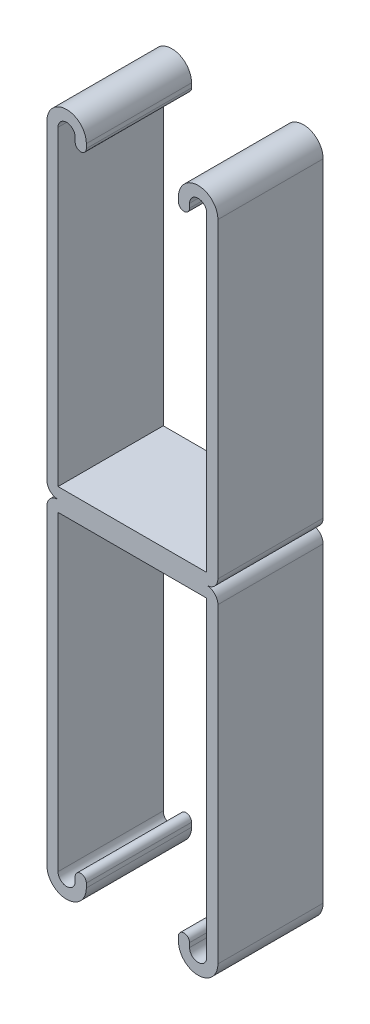
ISO-10303-21;
HEADER;
FILE_DESCRIPTION(('STEP AP214'),'2;1');
FILE_NAME('part.step','',(''),(''),'','','');
FILE_SCHEMA(('AUTOMOTIVE_DESIGN { 1 0 10303 214 1 1 1 1 }'));
ENDSEC;
DATA;
#1=APPLICATION_CONTEXT('core data for automotive mechanical design processes');
#2=APPLICATION_PROTOCOL_DEFINITION('international standard','automotive_design',2000,#1);
#3=PRODUCT_CONTEXT('',#1,'mechanical');
#4=PRODUCT('Part','Part','',(#3));
#5=PRODUCT_RELATED_PRODUCT_CATEGORY('part','',(#4));
#6=PRODUCT_DEFINITION_FORMATION('','',#4);
#7=PRODUCT_DEFINITION_CONTEXT('part definition',#1,'design');
#8=PRODUCT_DEFINITION('design','',#6,#7);
#9=PRODUCT_DEFINITION_SHAPE('','',#8);
#10=(LENGTH_UNIT() NAMED_UNIT(*) SI_UNIT(.MILLI.,.METRE.));
#11=(NAMED_UNIT(*) PLANE_ANGLE_UNIT() SI_UNIT($,.RADIAN.));
#12=(NAMED_UNIT(*) SI_UNIT($,.STERADIAN.) SOLID_ANGLE_UNIT());
#13=UNCERTAINTY_MEASURE_WITH_UNIT(LENGTH_MEASURE(1.E-05),#10,'distance_accuracy_value','');
#14=(GEOMETRIC_REPRESENTATION_CONTEXT(3) GLOBAL_UNCERTAINTY_ASSIGNED_CONTEXT((#13)) GLOBAL_UNIT_ASSIGNED_CONTEXT((#10,
#11,#12)) REPRESENTATION_CONTEXT('',''));
#15=CARTESIAN_POINT('',(0.,0.,0.));
#16=DIRECTION('',(0.,0.,1.));
#17=DIRECTION('',(1.,0.,0.));
#18=AXIS2_PLACEMENT_3D('',#15,#16,#17);
#19=CARTESIAN_POINT('',(-15.875,77.7875,12.7));
#20=DIRECTION('',(0.,0.,-1.));
#21=DIRECTION('',(-1.,0.,0.));
#22=AXIS2_PLACEMENT_3D('',#19,#20,#21);
#23=CYLINDRICAL_SURFACE('',#22,4.76250000000001);
#24=CARTESIAN_POINT('',(-15.875,77.7875,-12.7));
#25=DIRECTION('',(0.,0.,1.));
#26=DIRECTION('',(-1.,0.,0.));
#27=AXIS2_PLACEMENT_3D('',#24,#25,#26);
#28=CIRCLE('',#27,4.76250000000001);
#29=CARTESIAN_POINT('',(-11.1125,77.7875,-12.7));
#30=VERTEX_POINT('',#29);
#31=CARTESIAN_POINT('',(-20.6375,77.7875,-12.7));
#32=VERTEX_POINT('',#31);
#33=EDGE_CURVE('E189',#30,#32,#28,.T.);
#34=ORIENTED_EDGE('',*,*,#33,.T.);
#35=DIRECTION('',(0.,0.,-1.));
#36=VECTOR('',#35,1.);
#37=CARTESIAN_POINT('',(-20.6375,77.7875,12.7));
#38=LINE('',#37,#36);
#39=CARTESIAN_POINT('',(-20.6375,77.7875,12.7));
#40=VERTEX_POINT('',#39);
#41=EDGE_CURVE('E11',#40,#32,#38,.T.);
#42=ORIENTED_EDGE('',*,*,#41,.F.);
#43=CARTESIAN_POINT('',(-15.875,77.7875,12.7));
#44=DIRECTION('',(0.,0.,1.));
#45=DIRECTION('',(-1.,0.,0.));
#46=AXIS2_PLACEMENT_3D('',#43,#44,#45);
#47=CIRCLE('',#46,4.76250000000001);
#48=CARTESIAN_POINT('',(-11.1125,77.7875,12.7));
#49=VERTEX_POINT('',#48);
#50=EDGE_CURVE('E222',#49,#40,#47,.T.);
#51=ORIENTED_EDGE('',*,*,#50,.F.);
#52=DIRECTION('',(0.,0.,-1.));
#53=VECTOR('',#52,1.);
#54=CARTESIAN_POINT('',(-11.1125,77.7875,12.7));
#55=LINE('',#54,#53);
#56=EDGE_CURVE('E185',#49,#30,#55,.T.);
#57=ORIENTED_EDGE('',*,*,#56,.T.);
#58=EDGE_LOOP('',(#34,#42,#51,#57));
#59=FACE_BOUND('',#58,.T.);
#60=ADVANCED_FACE('F32',(#59),#23,.T.);
#61=CARTESIAN_POINT('',(-20.6375,77.7875,12.7));
#62=DIRECTION('',(1.,0.,0.));
#63=DIRECTION('',(0.,1.,0.));
#64=AXIS2_PLACEMENT_3D('',#61,#62,#63);
#65=PLANE('',#64);
#66=DIRECTION('',(0.,-1.,0.));
#67=VECTOR('',#66,1.);
#68=CARTESIAN_POINT('',(-20.6375,77.7875,-12.7));
#69=LINE('',#68,#67);
#70=CARTESIAN_POINT('',(-20.6375,2.6924,-12.7));
#71=VERTEX_POINT('',#70);
#72=EDGE_CURVE('E192',#32,#71,#69,.T.);
#73=ORIENTED_EDGE('',*,*,#72,.T.);
#74=DIRECTION('',(0.,0.,-1.));
#75=VECTOR('',#74,1.);
#76=CARTESIAN_POINT('',(-20.6375,2.6924,12.7));
#77=LINE('',#76,#75);
#78=CARTESIAN_POINT('',(-20.6375,2.6924,12.7));
#79=VERTEX_POINT('',#78);
#80=EDGE_CURVE('E40',#79,#71,#77,.T.);
#81=ORIENTED_EDGE('',*,*,#80,.F.);
#82=DIRECTION('',(0.,-1.,0.));
#83=VECTOR('',#82,1.);
#84=CARTESIAN_POINT('',(-20.6375,77.7875,12.7));
#85=LINE('',#84,#83);
#86=EDGE_CURVE('E119',#40,#79,#85,.T.);
#87=ORIENTED_EDGE('',*,*,#86,.F.);
#88=ORIENTED_EDGE('',*,*,#41,.T.);
#89=EDGE_LOOP('',(#73,#81,#87,#88));
#90=FACE_BOUND('',#89,.T.);
#91=ADVANCED_FACE('F384',(#90),#65,.F.);
#92=CARTESIAN_POINT('',(-17.9451,2.6924,12.7));
#93=DIRECTION('',(0.,0.,-1.));
#94=DIRECTION('',(-1.,0.,0.));
#95=AXIS2_PLACEMENT_3D('',#92,#93,#94);
#96=CYLINDRICAL_SURFACE('',#95,2.6924);
#97=CARTESIAN_POINT('',(-17.9451,2.6924,-12.7));
#98=DIRECTION('',(0.,0.,1.));
#99=DIRECTION('',(-1.,0.,0.));
#100=AXIS2_PLACEMENT_3D('',#97,#98,#99);
#101=CIRCLE('',#100,2.6924);
#102=CARTESIAN_POINT('',(-17.9451,0.,-12.7));
#103=VERTEX_POINT('',#102);
#104=EDGE_CURVE('E195',#71,#103,#101,.T.);
#105=ORIENTED_EDGE('',*,*,#104,.T.);
#106=DIRECTION('',(0.,0.,-1.));
#107=VECTOR('',#106,1.);
#108=CARTESIAN_POINT('',(-17.9451,0.,12.7));
#109=LINE('',#108,#107);
#110=CARTESIAN_POINT('',(-17.9451,0.,12.7));
#111=VERTEX_POINT('',#110);
#112=EDGE_CURVE('E259',#111,#103,#109,.T.);
#113=ORIENTED_EDGE('',*,*,#112,.F.);
#114=CARTESIAN_POINT('',(-17.9451,2.6924,12.7));
#115=DIRECTION('',(0.,0.,1.));
#116=DIRECTION('',(-1.,0.,0.));
#117=AXIS2_PLACEMENT_3D('',#114,#115,#116);
#118=CIRCLE('',#117,2.6924);
#119=EDGE_CURVE('E267',#79,#111,#118,.T.);
#120=ORIENTED_EDGE('',*,*,#119,.F.);
#121=ORIENTED_EDGE('',*,*,#80,.T.);
#122=EDGE_LOOP('',(#105,#113,#120,#121));
#123=FACE_BOUND('',#122,.T.);
#124=ADVANCED_FACE('F265',(#123),#96,.T.);
#125=CARTESIAN_POINT('',(17.9451,2.69240000000001,12.7));
#126=DIRECTION('',(0.,0.,-1.));
#127=DIRECTION('',(-1.,0.,0.));
#128=AXIS2_PLACEMENT_3D('',#125,#126,#127);
#129=CYLINDRICAL_SURFACE('',#128,2.6924);
#130=CARTESIAN_POINT('',(17.9451,2.69240000000001,-12.7));
#131=DIRECTION('',(0.,0.,1.));
#132=DIRECTION('',(1.,0.,0.));
#133=AXIS2_PLACEMENT_3D('',#130,#131,#132);
#134=CIRCLE('',#133,2.6924);
#135=CARTESIAN_POINT('',(17.9451,0.,-12.7));
#136=VERTEX_POINT('',#135);
#137=CARTESIAN_POINT('',(20.6375,2.69240000000001,-12.7));
#138=VERTEX_POINT('',#137);
#139=EDGE_CURVE('E197',#136,#138,#134,.T.);
#140=ORIENTED_EDGE('',*,*,#139,.T.);
#141=DIRECTION('',(0.,0.,-1.));
#142=VECTOR('',#141,1.);
#143=CARTESIAN_POINT('',(20.6375,2.69240000000001,12.7));
#144=LINE('',#143,#142);
#145=CARTESIAN_POINT('',(20.6375,2.69240000000001,12.7));
#146=VERTEX_POINT('',#145);
#147=EDGE_CURVE('E253',#146,#138,#144,.T.);
#148=ORIENTED_EDGE('',*,*,#147,.F.);
#149=CARTESIAN_POINT('',(17.9451,2.69240000000001,12.7));
#150=DIRECTION('',(0.,0.,1.));
#151=DIRECTION('',(1.,0.,0.));
#152=AXIS2_PLACEMENT_3D('',#149,#150,#151);
#153=CIRCLE('',#152,2.6924);
#154=CARTESIAN_POINT('',(17.9451,0.,12.7));
#155=VERTEX_POINT('',#154);
#156=EDGE_CURVE('E341',#155,#146,#153,.T.);
#157=ORIENTED_EDGE('',*,*,#156,.F.);
#158=DIRECTION('',(0.,0.,-1.));
#159=VECTOR('',#158,1.);
#160=CARTESIAN_POINT('',(17.9451,0.,12.7));
#161=LINE('',#160,#159);
#162=EDGE_CURVE('E256',#155,#136,#161,.T.);
#163=ORIENTED_EDGE('',*,*,#162,.T.);
#164=EDGE_LOOP('',(#140,#148,#157,#163));
#165=FACE_BOUND('',#164,.T.);
#166=ADVANCED_FACE('F391',(#165),#129,.T.);
#167=CARTESIAN_POINT('',(20.6375,2.69240000000001,12.7));
#168=DIRECTION('',(-1.,0.,0.));
#169=DIRECTION('',(0.,-1.,0.));
#170=AXIS2_PLACEMENT_3D('',#167,#168,#169);
#171=PLANE('',#170);
#172=DIRECTION('',(0.,1.,0.));
#173=VECTOR('',#172,1.);
#174=CARTESIAN_POINT('',(20.6375,2.69240000000001,-12.7));
#175=LINE('',#174,#173);
#176=CARTESIAN_POINT('',(20.6375,77.7875,-12.7));
#177=VERTEX_POINT('',#176);
#178=EDGE_CURVE('E199',#138,#177,#175,.T.);
#179=ORIENTED_EDGE('',*,*,#178,.T.);
#180=DIRECTION('',(0.,0.,-1.));
#181=VECTOR('',#180,1.);
#182=CARTESIAN_POINT('',(20.6375,77.7875,12.7));
#183=LINE('',#182,#181);
#184=CARTESIAN_POINT('',(20.6375,77.7875,12.7));
#185=VERTEX_POINT('',#184);
#186=EDGE_CURVE('E250',#185,#177,#183,.T.);
#187=ORIENTED_EDGE('',*,*,#186,.F.);
#188=DIRECTION('',(0.,1.,0.));
#189=VECTOR('',#188,1.);
#190=CARTESIAN_POINT('',(20.6375,2.69240000000001,12.7));
#191=LINE('',#190,#189);
#192=EDGE_CURVE('E343',#146,#185,#191,.T.);
#193=ORIENTED_EDGE('',*,*,#192,.F.);
#194=ORIENTED_EDGE('',*,*,#147,.T.);
#195=EDGE_LOOP('',(#179,#187,#193,#194));
#196=FACE_BOUND('',#195,.T.);
#197=ADVANCED_FACE('F396',(#196),#171,.F.);
#198=CARTESIAN_POINT('',(15.875,77.7875,12.7));
#199=DIRECTION('',(0.,0.,-1.));
#200=DIRECTION('',(-1.,0.,0.));
#201=AXIS2_PLACEMENT_3D('',#198,#199,#200);
#202=CYLINDRICAL_SURFACE('',#201,4.76250000000001);
#203=CARTESIAN_POINT('',(15.875,77.7875,-12.7));
#204=DIRECTION('',(0.,0.,1.));
#205=DIRECTION('',(1.,0.,0.));
#206=AXIS2_PLACEMENT_3D('',#203,#204,#205);
#207=CIRCLE('',#206,4.76250000000001);
#208=CARTESIAN_POINT('',(11.1125,77.7875,-12.7));
#209=VERTEX_POINT('',#208);
#210=EDGE_CURVE('E201',#177,#209,#207,.T.);
#211=ORIENTED_EDGE('',*,*,#210,.T.);
#212=DIRECTION('',(0.,0.,-1.));
#213=VECTOR('',#212,1.);
#214=CARTESIAN_POINT('',(11.1125,77.7875,12.7));
#215=LINE('',#214,#213);
#216=CARTESIAN_POINT('',(11.1125,77.7875,12.7));
#217=VERTEX_POINT('',#216);
#218=EDGE_CURVE('E247',#217,#209,#215,.T.);
#219=ORIENTED_EDGE('',*,*,#218,.F.);
#220=CARTESIAN_POINT('',(15.875,77.7875,12.7));
#221=DIRECTION('',(0.,0.,1.));
#222=DIRECTION('',(1.,0.,0.));
#223=AXIS2_PLACEMENT_3D('',#220,#221,#222);
#224=CIRCLE('',#223,4.76250000000001);
#225=EDGE_CURVE('E345',#185,#217,#224,.T.);
#226=ORIENTED_EDGE('',*,*,#225,.F.);
#227=ORIENTED_EDGE('',*,*,#186,.T.);
#228=EDGE_LOOP('',(#211,#219,#226,#227));
#229=FACE_BOUND('',#228,.T.);
#230=ADVANCED_FACE('F400',(#229),#202,.T.);
#231=CARTESIAN_POINT('',(11.1125,77.7875,12.7));
#232=DIRECTION('',(1.,0.,0.));
#233=DIRECTION('',(0.,1.,0.));
#234=AXIS2_PLACEMENT_3D('',#231,#232,#233);
#235=PLANE('',#234);
#236=DIRECTION('',(0.,-1.,0.));
#237=VECTOR('',#236,1.);
#238=CARTESIAN_POINT('',(11.1125,77.7875,-12.7));
#239=LINE('',#238,#237);
#240=CARTESIAN_POINT('',(11.1125,76.75245,-12.7));
#241=VERTEX_POINT('',#240);
#242=EDGE_CURVE('E203',#209,#241,#239,.T.);
#243=ORIENTED_EDGE('',*,*,#242,.T.);
#244=DIRECTION('',(0.,0.,-1.));
#245=VECTOR('',#244,1.);
#246=CARTESIAN_POINT('',(11.1125,76.75245,12.7));
#247=LINE('',#246,#245);
#248=CARTESIAN_POINT('',(11.1125,76.75245,12.7));
#249=VERTEX_POINT('',#248);
#250=EDGE_CURVE('E244',#249,#241,#247,.T.);
#251=ORIENTED_EDGE('',*,*,#250,.F.);
#252=DIRECTION('',(0.,-1.,0.));
#253=VECTOR('',#252,1.);
#254=CARTESIAN_POINT('',(11.1125,77.7875,12.7));
#255=LINE('',#254,#253);
#256=EDGE_CURVE('E347',#217,#249,#255,.T.);
#257=ORIENTED_EDGE('',*,*,#256,.F.);
#258=ORIENTED_EDGE('',*,*,#218,.T.);
#259=EDGE_LOOP('',(#243,#251,#257,#258));
#260=FACE_BOUND('',#259,.T.);
#261=ADVANCED_FACE('F404',(#260),#235,.F.);
#262=CARTESIAN_POINT('',(12.4587,76.75245,12.7));
#263=DIRECTION('',(0.,0.,-1.));
#264=DIRECTION('',(-1.,0.,0.));
#265=AXIS2_PLACEMENT_3D('',#262,#263,#264);
#266=CYLINDRICAL_SURFACE('',#265,1.3462);
#267=CARTESIAN_POINT('',(12.4587,76.75245,-12.7));
#268=DIRECTION('',(0.,0.,1.));
#269=DIRECTION('',(1.,0.,0.));
#270=AXIS2_PLACEMENT_3D('',#267,#268,#269);
#271=CIRCLE('',#270,1.3462);
#272=CARTESIAN_POINT('',(13.8049,76.75245,-12.7));
#273=VERTEX_POINT('',#272);
#274=EDGE_CURVE('E205',#241,#273,#271,.T.);
#275=ORIENTED_EDGE('',*,*,#274,.T.);
#276=DIRECTION('',(0.,0.,-1.));
#277=VECTOR('',#276,1.);
#278=CARTESIAN_POINT('',(13.8049,76.75245,12.7));
#279=LINE('',#278,#277);
#280=CARTESIAN_POINT('',(13.8049,76.75245,12.7));
#281=VERTEX_POINT('',#280);
#282=EDGE_CURVE('E241',#281,#273,#279,.T.);
#283=ORIENTED_EDGE('',*,*,#282,.F.);
#284=CARTESIAN_POINT('',(12.4587,76.75245,12.7));
#285=DIRECTION('',(0.,0.,1.));
#286=DIRECTION('',(1.,0.,0.));
#287=AXIS2_PLACEMENT_3D('',#284,#285,#286);
#288=CIRCLE('',#287,1.3462);
#289=EDGE_CURVE('E349',#249,#281,#288,.T.);
#290=ORIENTED_EDGE('',*,*,#289,.F.);
#291=ORIENTED_EDGE('',*,*,#250,.T.);
#292=EDGE_LOOP('',(#275,#283,#290,#291));
#293=FACE_BOUND('',#292,.T.);
#294=ADVANCED_FACE('F408',(#293),#266,.T.);
#295=CARTESIAN_POINT('',(13.8049,77.7875,12.7));
#296=DIRECTION('',(-1.,0.,0.));
#297=DIRECTION('',(0.,-1.,0.));
#298=AXIS2_PLACEMENT_3D('',#295,#296,#297);
#299=PLANE('',#298);
#300=DIRECTION('',(0.,1.,0.));
#301=VECTOR('',#300,1.);
#302=CARTESIAN_POINT('',(13.8049,77.7875,-12.7));
#303=LINE('',#302,#301);
#304=CARTESIAN_POINT('',(13.8049,77.7875,-12.7));
#305=VERTEX_POINT('',#304);
#306=EDGE_CURVE('E207',#273,#305,#303,.T.);
#307=ORIENTED_EDGE('',*,*,#306,.T.);
#308=DIRECTION('',(0.,0.,-1.));
#309=VECTOR('',#308,1.);
#310=CARTESIAN_POINT('',(13.8049,77.7875,12.7));
#311=LINE('',#310,#309);
#312=CARTESIAN_POINT('',(13.8049,77.7875,12.7));
#313=VERTEX_POINT('',#312);
#314=EDGE_CURVE('E238',#313,#305,#311,.T.);
#315=ORIENTED_EDGE('',*,*,#314,.F.);
#316=DIRECTION('',(0.,1.,0.));
#317=VECTOR('',#316,1.);
#318=CARTESIAN_POINT('',(13.8049,77.7875,12.7));
#319=LINE('',#318,#317);
#320=EDGE_CURVE('E351',#281,#313,#319,.T.);
#321=ORIENTED_EDGE('',*,*,#320,.F.);
#322=ORIENTED_EDGE('',*,*,#282,.T.);
#323=EDGE_LOOP('',(#307,#315,#321,#322));
#324=FACE_BOUND('',#323,.T.);
#325=ADVANCED_FACE('F412',(#324),#299,.F.);
#326=CARTESIAN_POINT('',(15.875,77.7875,12.7));
#327=DIRECTION('',(0.,0.,-1.));
#328=DIRECTION('',(-1.,0.,0.));
#329=AXIS2_PLACEMENT_3D('',#326,#327,#328);
#330=CYLINDRICAL_SURFACE('',#329,2.07010000000001);
#331=CARTESIAN_POINT('',(15.875,77.7875,-12.7));
#332=DIRECTION('',(0.,0.,-1.));
#333=DIRECTION('',(1.,0.,0.));
#334=AXIS2_PLACEMENT_3D('',#331,#332,#333);
#335=CIRCLE('',#334,2.07010000000001);
#336=CARTESIAN_POINT('',(17.9451,77.7875,-12.7));
#337=VERTEX_POINT('',#336);
#338=EDGE_CURVE('E209',#305,#337,#335,.T.);
#339=ORIENTED_EDGE('',*,*,#338,.T.);
#340=DIRECTION('',(0.,0.,-1.));
#341=VECTOR('',#340,1.);
#342=CARTESIAN_POINT('',(17.9451,77.7875,12.7));
#343=LINE('',#342,#341);
#344=CARTESIAN_POINT('',(17.9451,77.7875,12.7));
#345=VERTEX_POINT('',#344);
#346=EDGE_CURVE('E235',#345,#337,#343,.T.);
#347=ORIENTED_EDGE('',*,*,#346,.F.);
#348=CARTESIAN_POINT('',(15.875,77.7875,12.7));
#349=DIRECTION('',(0.,0.,-1.));
#350=DIRECTION('',(1.,0.,0.));
#351=AXIS2_PLACEMENT_3D('',#348,#349,#350);
#352=CIRCLE('',#351,2.07010000000001);
#353=EDGE_CURVE('E353',#313,#345,#352,.T.);
#354=ORIENTED_EDGE('',*,*,#353,.F.);
#355=ORIENTED_EDGE('',*,*,#314,.T.);
#356=EDGE_LOOP('',(#339,#347,#354,#355));
#357=FACE_BOUND('',#356,.T.);
#358=ADVANCED_FACE('F416',(#357),#330,.F.);
#359=CARTESIAN_POINT('',(17.9451,2.6924,12.7));
#360=DIRECTION('',(1.,0.,0.));
#361=DIRECTION('',(0.,1.,0.));
#362=AXIS2_PLACEMENT_3D('',#359,#360,#361);
#363=PLANE('',#362);
#364=DIRECTION('',(0.,-1.,0.));
#365=VECTOR('',#364,1.);
#366=CARTESIAN_POINT('',(17.9451,2.6924,-12.7));
#367=LINE('',#366,#365);
#368=CARTESIAN_POINT('',(17.9451,2.6924,-12.7));
#369=VERTEX_POINT('',#368);
#370=EDGE_CURVE('E211',#337,#369,#367,.T.);
#371=ORIENTED_EDGE('',*,*,#370,.T.);
#372=DIRECTION('',(0.,0.,-1.));
#373=VECTOR('',#372,1.);
#374=CARTESIAN_POINT('',(17.9451,2.6924,12.7));
#375=LINE('',#374,#373);
#376=CARTESIAN_POINT('',(17.9451,2.6924,12.7));
#377=VERTEX_POINT('',#376);
#378=EDGE_CURVE('E232',#377,#369,#375,.T.);
#379=ORIENTED_EDGE('',*,*,#378,.F.);
#380=DIRECTION('',(0.,-1.,0.));
#381=VECTOR('',#380,1.);
#382=CARTESIAN_POINT('',(17.9451,2.6924,12.7));
#383=LINE('',#382,#381);
#384=EDGE_CURVE('E355',#345,#377,#383,.T.);
#385=ORIENTED_EDGE('',*,*,#384,.F.);
#386=ORIENTED_EDGE('',*,*,#346,.T.);
#387=EDGE_LOOP('',(#371,#379,#385,#386));
#388=FACE_BOUND('',#387,.T.);
#389=ADVANCED_FACE('F420',(#388),#363,.F.);
#390=CARTESIAN_POINT('',(-17.9451,2.6924,12.7));
#391=DIRECTION('',(0.,-1.,0.));
#392=DIRECTION('',(0.,0.,-1.));
#393=AXIS2_PLACEMENT_3D('',#390,#391,#392);
#394=PLANE('',#393);
#395=DIRECTION('',(-1.,0.,0.));
#396=VECTOR('',#395,1.);
#397=CARTESIAN_POINT('',(-17.9451,2.6924,-12.7));
#398=LINE('',#397,#396);
#399=CARTESIAN_POINT('',(-17.9451,2.6924,-12.7));
#400=VERTEX_POINT('',#399);
#401=EDGE_CURVE('E213',#369,#400,#398,.T.);
#402=ORIENTED_EDGE('',*,*,#401,.T.);
#403=DIRECTION('',(0.,0.,-1.));
#404=VECTOR('',#403,1.);
#405=CARTESIAN_POINT('',(-17.9451,2.6924,12.7));
#406=LINE('',#405,#404);
#407=CARTESIAN_POINT('',(-17.9451,2.6924,12.7));
#408=VERTEX_POINT('',#407);
#409=EDGE_CURVE('E229',#408,#400,#406,.T.);
#410=ORIENTED_EDGE('',*,*,#409,.F.);
#411=DIRECTION('',(-1.,0.,0.));
#412=VECTOR('',#411,1.);
#413=CARTESIAN_POINT('',(-17.9451,2.6924,12.7));
#414=LINE('',#413,#412);
#415=EDGE_CURVE('E357',#377,#408,#414,.T.);
#416=ORIENTED_EDGE('',*,*,#415,.F.);
#417=ORIENTED_EDGE('',*,*,#378,.T.);
#418=EDGE_LOOP('',(#402,#410,#416,#417));
#419=FACE_BOUND('',#418,.T.);
#420=ADVANCED_FACE('F424',(#419),#394,.F.);
#421=CARTESIAN_POINT('',(-17.9451,77.7875,12.7));
#422=DIRECTION('',(-1.,0.,0.));
#423=DIRECTION('',(0.,-1.,0.));
#424=AXIS2_PLACEMENT_3D('',#421,#422,#423);
#425=PLANE('',#424);
#426=DIRECTION('',(0.,1.,0.));
#427=VECTOR('',#426,1.);
#428=CARTESIAN_POINT('',(-17.9451,77.7875,-12.7));
#429=LINE('',#428,#427);
#430=CARTESIAN_POINT('',(-17.9451,77.7875,-12.7));
#431=VERTEX_POINT('',#430);
#432=EDGE_CURVE('E215',#400,#431,#429,.T.);
#433=ORIENTED_EDGE('',*,*,#432,.T.);
#434=DIRECTION('',(0.,0.,-1.));
#435=VECTOR('',#434,1.);
#436=CARTESIAN_POINT('',(-17.9451,77.7875,12.7));
#437=LINE('',#436,#435);
#438=CARTESIAN_POINT('',(-17.9451,77.7875,12.7));
#439=VERTEX_POINT('',#438);
#440=EDGE_CURVE('E226',#439,#431,#437,.T.);
#441=ORIENTED_EDGE('',*,*,#440,.F.);
#442=DIRECTION('',(0.,1.,0.));
#443=VECTOR('',#442,1.);
#444=CARTESIAN_POINT('',(-17.9451,77.7875,12.7));
#445=LINE('',#444,#443);
#446=EDGE_CURVE('E359',#408,#439,#445,.T.);
#447=ORIENTED_EDGE('',*,*,#446,.F.);
#448=ORIENTED_EDGE('',*,*,#409,.T.);
#449=EDGE_LOOP('',(#433,#441,#447,#448));
#450=FACE_BOUND('',#449,.T.);
#451=ADVANCED_FACE('F365',(#450),#425,.F.);
#452=CARTESIAN_POINT('',(-15.875,77.7875,12.7));
#453=DIRECTION('',(0.,0.,-1.));
#454=DIRECTION('',(-1.,0.,0.));
#455=AXIS2_PLACEMENT_3D('',#452,#453,#454);
#456=CYLINDRICAL_SURFACE('',#455,2.07010000000001);
#457=CARTESIAN_POINT('',(-15.875,77.7875,-12.7));
#458=DIRECTION('',(0.,0.,-1.));
#459=DIRECTION('',(-1.,0.,0.));
#460=AXIS2_PLACEMENT_3D('',#457,#458,#459);
#461=CIRCLE('',#460,2.07010000000001);
#462=CARTESIAN_POINT('',(-13.8049,77.7875,-12.7));
#463=VERTEX_POINT('',#462);
#464=EDGE_CURVE('E217',#431,#463,#461,.T.);
#465=ORIENTED_EDGE('',*,*,#464,.T.);
#466=DIRECTION('',(0.,0.,-1.));
#467=VECTOR('',#466,1.);
#468=CARTESIAN_POINT('',(-13.8049,77.7875,12.7));
#469=LINE('',#468,#467);
#470=CARTESIAN_POINT('',(-13.8049,77.7875,12.7));
#471=VERTEX_POINT('',#470);
#472=EDGE_CURVE('E180',#471,#463,#469,.T.);
#473=ORIENTED_EDGE('',*,*,#472,.F.);
#474=CARTESIAN_POINT('',(-15.875,77.7875,12.7));
#475=DIRECTION('',(0.,0.,-1.));
#476=DIRECTION('',(-1.,0.,0.));
#477=AXIS2_PLACEMENT_3D('',#474,#475,#476);
#478=CIRCLE('',#477,2.07010000000001);
#479=EDGE_CURVE('E171',#439,#471,#478,.T.);
#480=ORIENTED_EDGE('',*,*,#479,.F.);
#481=ORIENTED_EDGE('',*,*,#440,.T.);
#482=EDGE_LOOP('',(#465,#473,#480,#481));
#483=FACE_BOUND('',#482,.T.);
#484=ADVANCED_FACE('F369',(#483),#456,.F.);
#485=CARTESIAN_POINT('',(-13.8049,77.7875,12.7));
#486=DIRECTION('',(1.,0.,0.));
#487=DIRECTION('',(0.,1.,0.));
#488=AXIS2_PLACEMENT_3D('',#485,#486,#487);
#489=PLANE('',#488);
#490=DIRECTION('',(0.,-1.,0.));
#491=VECTOR('',#490,1.);
#492=CARTESIAN_POINT('',(-13.8049,77.7875,-12.7));
#493=LINE('',#492,#491);
#494=CARTESIAN_POINT('',(-13.8049,76.75245,-12.7));
#495=VERTEX_POINT('',#494);
#496=EDGE_CURVE('E179',#463,#495,#493,.T.);
#497=ORIENTED_EDGE('',*,*,#496,.T.);
#498=DIRECTION('',(0.,0.,-1.));
#499=VECTOR('',#498,1.);
#500=CARTESIAN_POINT('',(-13.8049,76.75245,12.7));
#501=LINE('',#500,#499);
#502=CARTESIAN_POINT('',(-13.8049,76.75245,12.7));
#503=VERTEX_POINT('',#502);
#504=EDGE_CURVE('E176',#503,#495,#501,.T.);
#505=ORIENTED_EDGE('',*,*,#504,.F.);
#506=DIRECTION('',(0.,-1.,0.));
#507=VECTOR('',#506,1.);
#508=CARTESIAN_POINT('',(-13.8049,77.7875,12.7));
#509=LINE('',#508,#507);
#510=EDGE_CURVE('E165',#471,#503,#509,.T.);
#511=ORIENTED_EDGE('',*,*,#510,.F.);
#512=ORIENTED_EDGE('',*,*,#472,.T.);
#513=EDGE_LOOP('',(#497,#505,#511,#512));
#514=FACE_BOUND('',#513,.T.);
#515=ADVANCED_FACE('F177',(#514),#489,.F.);
#516=CARTESIAN_POINT('',(-12.4587,76.75245,12.7));
#517=DIRECTION('',(0.,0.,-1.));
#518=DIRECTION('',(-1.,0.,0.));
#519=AXIS2_PLACEMENT_3D('',#516,#517,#518);
#520=CYLINDRICAL_SURFACE('',#519,1.3462);
#521=CARTESIAN_POINT('',(-12.4587,76.75245,-12.7));
#522=DIRECTION('',(0.,0.,1.));
#523=DIRECTION('',(-1.,0.,0.));
#524=AXIS2_PLACEMENT_3D('',#521,#522,#523);
#525=CIRCLE('',#524,1.3462);
#526=CARTESIAN_POINT('',(-11.1125,76.75245,-12.7));
#527=VERTEX_POINT('',#526);
#528=EDGE_CURVE('E105',#495,#527,#525,.T.);
#529=ORIENTED_EDGE('',*,*,#528,.T.);
#530=DIRECTION('',(0.,0.,-1.));
#531=VECTOR('',#530,1.);
#532=CARTESIAN_POINT('',(-11.1125,76.75245,12.7));
#533=LINE('',#532,#531);
#534=CARTESIAN_POINT('',(-11.1125,76.75245,12.7));
#535=VERTEX_POINT('',#534);
#536=EDGE_CURVE('E181',#535,#527,#533,.T.);
#537=ORIENTED_EDGE('',*,*,#536,.F.);
#538=CARTESIAN_POINT('',(-12.4587,76.75245,12.7));
#539=DIRECTION('',(0.,0.,1.));
#540=DIRECTION('',(-1.,0.,0.));
#541=AXIS2_PLACEMENT_3D('',#538,#539,#540);
#542=CIRCLE('',#541,1.3462);
#543=EDGE_CURVE('E169',#503,#535,#542,.T.);
#544=ORIENTED_EDGE('',*,*,#543,.F.);
#545=ORIENTED_EDGE('',*,*,#504,.T.);
#546=EDGE_LOOP('',(#529,#537,#544,#545));
#547=FACE_BOUND('',#546,.T.);
#548=ADVANCED_FACE('F183',(#547),#520,.T.);
#549=CARTESIAN_POINT('',(-11.1125,77.7875,12.7));
#550=DIRECTION('',(-1.,0.,0.));
#551=DIRECTION('',(0.,-1.,0.));
#552=AXIS2_PLACEMENT_3D('',#549,#550,#551);
#553=PLANE('',#552);
#554=DIRECTION('',(0.,1.,0.));
#555=VECTOR('',#554,1.);
#556=CARTESIAN_POINT('',(-11.1125,77.7875,-12.7));
#557=LINE('',#556,#555);
#558=EDGE_CURVE('E111',#527,#30,#557,.T.);
#559=ORIENTED_EDGE('',*,*,#558,.T.);
#560=ORIENTED_EDGE('',*,*,#56,.F.);
#561=DIRECTION('',(0.,1.,0.));
#562=VECTOR('',#561,1.);
#563=CARTESIAN_POINT('',(-11.1125,77.7875,12.7));
#564=LINE('',#563,#562);
#565=EDGE_CURVE('E48',#535,#49,#564,.T.);
#566=ORIENTED_EDGE('',*,*,#565,.F.);
#567=ORIENTED_EDGE('',*,*,#536,.T.);
#568=EDGE_LOOP('',(#559,#560,#566,#567));
#569=FACE_BOUND('',#568,.T.);
#570=ADVANCED_FACE('F373',(#569),#553,.F.);
#571=CARTESIAN_POINT('',(-15.875,77.7875,12.7));
#572=DIRECTION('',(0.,0.,-1.));
#573=DIRECTION('',(-1.,0.,0.));
#574=AXIS2_PLACEMENT_3D('',#571,#572,#573);
#575=PLANE('',#574);
#576=ORIENTED_EDGE('',*,*,#50,.T.);
#577=ORIENTED_EDGE('',*,*,#86,.T.);
#578=ORIENTED_EDGE('',*,*,#119,.T.);
#579=CARTESIAN_POINT('',(-17.9451,-2.6924,12.7));
#580=DIRECTION('',(0.,0.,-1.));
#581=DIRECTION('',(-1.,0.,0.));
#582=AXIS2_PLACEMENT_3D('',#579,#580,#581);
#583=CIRCLE('',#582,2.6924);
#584=CARTESIAN_POINT('',(-20.6375,-2.6924,12.7));
#585=VERTEX_POINT('',#584);
#586=EDGE_CURVE('E782',#585,#111,#583,.T.);
#587=ORIENTED_EDGE('',*,*,#586,.F.);
#588=DIRECTION('',(0.,1.,0.));
#589=VECTOR('',#588,1.);
#590=CARTESIAN_POINT('',(-20.6375,-77.7875,12.7));
#591=LINE('',#590,#589);
#592=CARTESIAN_POINT('',(-20.6375,-77.7875,12.7));
#593=VERTEX_POINT('',#592);
#594=EDGE_CURVE('E294',#593,#585,#591,.T.);
#595=ORIENTED_EDGE('',*,*,#594,.F.);
#596=CARTESIAN_POINT('',(-15.875,-77.7875,12.7));
#597=DIRECTION('',(0.,0.,-1.));
#598=DIRECTION('',(-1.,0.,0.));
#599=AXIS2_PLACEMENT_3D('',#596,#597,#598);
#600=CIRCLE('',#599,4.76250000000001);
#601=CARTESIAN_POINT('',(-11.1125,-77.7875,12.7));
#602=VERTEX_POINT('',#601);
#603=EDGE_CURVE('E283',#602,#593,#600,.T.);
#604=ORIENTED_EDGE('',*,*,#603,.F.);
#605=DIRECTION('',(0.,-1.,0.));
#606=VECTOR('',#605,1.);
#607=CARTESIAN_POINT('',(-11.1125,-77.7875,12.7));
#608=LINE('',#607,#606);
#609=CARTESIAN_POINT('',(-11.1125,-76.75245,12.7));
#610=VERTEX_POINT('',#609);
#611=EDGE_CURVE('E731',#610,#602,#608,.T.);
#612=ORIENTED_EDGE('',*,*,#611,.F.);
#613=CARTESIAN_POINT('',(-12.4587,-76.75245,12.7));
#614=DIRECTION('',(0.,0.,-1.));
#615=DIRECTION('',(-1.,0.,0.));
#616=AXIS2_PLACEMENT_3D('',#613,#614,#615);
#617=CIRCLE('',#616,1.3462);
#618=CARTESIAN_POINT('',(-13.8049,-76.75245,12.7));
#619=VERTEX_POINT('',#618);
#620=EDGE_CURVE('E740',#619,#610,#617,.T.);
#621=ORIENTED_EDGE('',*,*,#620,.F.);
#622=DIRECTION('',(0.,1.,0.));
#623=VECTOR('',#622,1.);
#624=CARTESIAN_POINT('',(-13.8049,-77.7875,12.7));
#625=LINE('',#624,#623);
#626=CARTESIAN_POINT('',(-13.8049,-77.7875,12.7));
#627=VERTEX_POINT('',#626);
#628=EDGE_CURVE('E744',#627,#619,#625,.T.);
#629=ORIENTED_EDGE('',*,*,#628,.F.);
#630=CARTESIAN_POINT('',(-15.875,-77.7875,12.7));
#631=DIRECTION('',(0.,0.,1.));
#632=DIRECTION('',(-1.,0.,0.));
#633=AXIS2_PLACEMENT_3D('',#630,#631,#632);
#634=CIRCLE('',#633,2.07010000000001);
#635=CARTESIAN_POINT('',(-17.9451,-77.7875,12.7));
#636=VERTEX_POINT('',#635);
#637=EDGE_CURVE('E746',#636,#627,#634,.T.);
#638=ORIENTED_EDGE('',*,*,#637,.F.);
#639=DIRECTION('',(0.,-1.,0.));
#640=VECTOR('',#639,1.);
#641=CARTESIAN_POINT('',(-17.9451,-77.7875,12.7));
#642=LINE('',#641,#640);
#643=CARTESIAN_POINT('',(-17.9451,-2.6924,12.7));
#644=VERTEX_POINT('',#643);
#645=EDGE_CURVE('E752',#644,#636,#642,.T.);
#646=ORIENTED_EDGE('',*,*,#645,.F.);
#647=DIRECTION('',(-1.,0.,0.));
#648=VECTOR('',#647,1.);
#649=CARTESIAN_POINT('',(-17.9451,-2.6924,12.7));
#650=LINE('',#649,#648);
#651=CARTESIAN_POINT('',(17.9451,-2.6924,12.7));
#652=VERTEX_POINT('',#651);
#653=EDGE_CURVE('E755',#652,#644,#650,.T.);
#654=ORIENTED_EDGE('',*,*,#653,.F.);
#655=DIRECTION('',(0.,1.,0.));
#656=VECTOR('',#655,1.);
#657=CARTESIAN_POINT('',(17.9451,-2.6924,12.7));
#658=LINE('',#657,#656);
#659=CARTESIAN_POINT('',(17.9451,-77.7875,12.7));
#660=VERTEX_POINT('',#659);
#661=EDGE_CURVE('E758',#660,#652,#658,.T.);
#662=ORIENTED_EDGE('',*,*,#661,.F.);
#663=CARTESIAN_POINT('',(15.875,-77.7875,12.7));
#664=DIRECTION('',(0.,0.,1.));
#665=DIRECTION('',(1.,0.,0.));
#666=AXIS2_PLACEMENT_3D('',#663,#664,#665);
#667=CIRCLE('',#666,2.07010000000001);
#668=CARTESIAN_POINT('',(13.8049,-77.7875,12.7));
#669=VERTEX_POINT('',#668);
#670=EDGE_CURVE('E761',#669,#660,#667,.T.);
#671=ORIENTED_EDGE('',*,*,#670,.F.);
#672=DIRECTION('',(0.,-1.,0.));
#673=VECTOR('',#672,1.);
#674=CARTESIAN_POINT('',(13.8049,-77.7875,12.7));
#675=LINE('',#674,#673);
#676=CARTESIAN_POINT('',(13.8049,-76.75245,12.7));
#677=VERTEX_POINT('',#676);
#678=EDGE_CURVE('E764',#677,#669,#675,.T.);
#679=ORIENTED_EDGE('',*,*,#678,.F.);
#680=CARTESIAN_POINT('',(12.4587,-76.75245,12.7));
#681=DIRECTION('',(0.,0.,-1.));
#682=DIRECTION('',(1.,0.,0.));
#683=AXIS2_PLACEMENT_3D('',#680,#681,#682);
#684=CIRCLE('',#683,1.3462);
#685=CARTESIAN_POINT('',(11.1125,-76.75245,12.7));
#686=VERTEX_POINT('',#685);
#687=EDGE_CURVE('E767',#686,#677,#684,.T.);
#688=ORIENTED_EDGE('',*,*,#687,.F.);
#689=DIRECTION('',(0.,1.,0.));
#690=VECTOR('',#689,1.);
#691=CARTESIAN_POINT('',(11.1125,-77.7875,12.7));
#692=LINE('',#691,#690);
#693=CARTESIAN_POINT('',(11.1125,-77.7875,12.7));
#694=VERTEX_POINT('',#693);
#695=EDGE_CURVE('E770',#694,#686,#692,.T.);
#696=ORIENTED_EDGE('',*,*,#695,.F.);
#697=CARTESIAN_POINT('',(15.875,-77.7875,12.7));
#698=DIRECTION('',(0.,0.,-1.));
#699=DIRECTION('',(1.,0.,0.));
#700=AXIS2_PLACEMENT_3D('',#697,#698,#699);
#701=CIRCLE('',#700,4.76250000000001);
#702=CARTESIAN_POINT('',(20.6375,-77.7875,12.7));
#703=VERTEX_POINT('',#702);
#704=EDGE_CURVE('E773',#703,#694,#701,.T.);
#705=ORIENTED_EDGE('',*,*,#704,.F.);
#706=DIRECTION('',(0.,-1.,0.));
#707=VECTOR('',#706,1.);
#708=CARTESIAN_POINT('',(20.6375,-2.69240000000001,12.7));
#709=LINE('',#708,#707);
#710=CARTESIAN_POINT('',(20.6375,-2.69240000000001,12.7));
#711=VERTEX_POINT('',#710);
#712=EDGE_CURVE('E776',#711,#703,#709,.T.);
#713=ORIENTED_EDGE('',*,*,#712,.F.);
#714=CARTESIAN_POINT('',(17.9451,-2.69240000000001,12.7));
#715=DIRECTION('',(0.,0.,-1.));
#716=DIRECTION('',(1.,0.,0.));
#717=AXIS2_PLACEMENT_3D('',#714,#715,#716);
#718=CIRCLE('',#717,2.6924);
#719=EDGE_CURVE('E779',#155,#711,#718,.T.);
#720=ORIENTED_EDGE('',*,*,#719,.F.);
#721=ORIENTED_EDGE('',*,*,#156,.T.);
#722=ORIENTED_EDGE('',*,*,#192,.T.);
#723=ORIENTED_EDGE('',*,*,#225,.T.);
#724=ORIENTED_EDGE('',*,*,#256,.T.);
#725=ORIENTED_EDGE('',*,*,#289,.T.);
#726=ORIENTED_EDGE('',*,*,#320,.T.);
#727=ORIENTED_EDGE('',*,*,#353,.T.);
#728=ORIENTED_EDGE('',*,*,#384,.T.);
#729=ORIENTED_EDGE('',*,*,#415,.T.);
#730=ORIENTED_EDGE('',*,*,#446,.T.);
#731=ORIENTED_EDGE('',*,*,#479,.T.);
#732=ORIENTED_EDGE('',*,*,#510,.T.);
#733=ORIENTED_EDGE('',*,*,#543,.T.);
#734=ORIENTED_EDGE('',*,*,#565,.T.);
#735=EDGE_LOOP('',(#576,#577,#578,#587,#595,#604,#612,#621,#629,#638,#646,#654,#662,#671,#679,
#688,#696,#705,#713,#720,#721,#722,#723,#724,#725,#726,#727,#728,#729,#730,#731,#732,#733,#734));
#736=FACE_BOUND('',#735,.T.);
#737=ADVANCED_FACE('F167',(#736),#575,.F.);
#738=CARTESIAN_POINT('',(-15.875,77.7875,-12.7));
#739=DIRECTION('',(0.,0.,-1.));
#740=DIRECTION('',(-1.,0.,0.));
#741=AXIS2_PLACEMENT_3D('',#738,#739,#740);
#742=PLANE('',#741);
#743=ORIENTED_EDGE('',*,*,#33,.F.);
#744=ORIENTED_EDGE('',*,*,#558,.F.);
#745=ORIENTED_EDGE('',*,*,#528,.F.);
#746=ORIENTED_EDGE('',*,*,#496,.F.);
#747=ORIENTED_EDGE('',*,*,#464,.F.);
#748=ORIENTED_EDGE('',*,*,#432,.F.);
#749=ORIENTED_EDGE('',*,*,#401,.F.);
#750=ORIENTED_EDGE('',*,*,#370,.F.);
#751=ORIENTED_EDGE('',*,*,#338,.F.);
#752=ORIENTED_EDGE('',*,*,#306,.F.);
#753=ORIENTED_EDGE('',*,*,#274,.F.);
#754=ORIENTED_EDGE('',*,*,#242,.F.);
#755=ORIENTED_EDGE('',*,*,#210,.F.);
#756=ORIENTED_EDGE('',*,*,#178,.F.);
#757=ORIENTED_EDGE('',*,*,#139,.F.);
#758=CARTESIAN_POINT('',(17.9451,-2.69240000000001,-12.7));
#759=DIRECTION('',(0.,0.,-1.));
#760=DIRECTION('',(1.,0.,0.));
#761=AXIS2_PLACEMENT_3D('',#758,#759,#760);
#762=CIRCLE('',#761,2.6924);
#763=CARTESIAN_POINT('',(20.6375,-2.69240000000001,-12.7));
#764=VERTEX_POINT('',#763);
#765=EDGE_CURVE('E281',#136,#764,#762,.T.);
#766=ORIENTED_EDGE('',*,*,#765,.T.);
#767=DIRECTION('',(0.,-1.,0.));
#768=VECTOR('',#767,1.);
#769=CARTESIAN_POINT('',(20.6375,-2.69240000000001,-12.7));
#770=LINE('',#769,#768);
#771=CARTESIAN_POINT('',(20.6375,-77.7875,-12.7));
#772=VERTEX_POINT('',#771);
#773=EDGE_CURVE('E286',#764,#772,#770,.T.);
#774=ORIENTED_EDGE('',*,*,#773,.T.);
#775=CARTESIAN_POINT('',(15.875,-77.7875,-12.7));
#776=DIRECTION('',(0.,0.,-1.));
#777=DIRECTION('',(1.,0.,0.));
#778=AXIS2_PLACEMENT_3D('',#775,#776,#777);
#779=CIRCLE('',#778,4.76250000000001);
#780=CARTESIAN_POINT('',(11.1125,-77.7875,-12.7));
#781=VERTEX_POINT('',#780);
#782=EDGE_CURVE('E818',#772,#781,#779,.T.);
#783=ORIENTED_EDGE('',*,*,#782,.T.);
#784=DIRECTION('',(0.,1.,0.));
#785=VECTOR('',#784,1.);
#786=CARTESIAN_POINT('',(11.1125,-77.7875,-12.7));
#787=LINE('',#786,#785);
#788=CARTESIAN_POINT('',(11.1125,-76.75245,-12.7));
#789=VERTEX_POINT('',#788);
#790=EDGE_CURVE('E815',#781,#789,#787,.T.);
#791=ORIENTED_EDGE('',*,*,#790,.T.);
#792=CARTESIAN_POINT('',(12.4587,-76.75245,-12.7));
#793=DIRECTION('',(0.,0.,-1.));
#794=DIRECTION('',(1.,0.,0.));
#795=AXIS2_PLACEMENT_3D('',#792,#793,#794);
#796=CIRCLE('',#795,1.3462);
#797=CARTESIAN_POINT('',(13.8049,-76.75245,-12.7));
#798=VERTEX_POINT('',#797);
#799=EDGE_CURVE('E812',#789,#798,#796,.T.);
#800=ORIENTED_EDGE('',*,*,#799,.T.);
#801=DIRECTION('',(0.,-1.,0.));
#802=VECTOR('',#801,1.);
#803=CARTESIAN_POINT('',(13.8049,-77.7875,-12.7));
#804=LINE('',#803,#802);
#805=CARTESIAN_POINT('',(13.8049,-77.7875,-12.7));
#806=VERTEX_POINT('',#805);
#807=EDGE_CURVE('E809',#798,#806,#804,.T.);
#808=ORIENTED_EDGE('',*,*,#807,.T.);
#809=CARTESIAN_POINT('',(15.875,-77.7875,-12.7));
#810=DIRECTION('',(0.,0.,1.));
#811=DIRECTION('',(1.,0.,0.));
#812=AXIS2_PLACEMENT_3D('',#809,#810,#811);
#813=CIRCLE('',#812,2.07010000000001);
#814=CARTESIAN_POINT('',(17.9451,-77.7875,-12.7));
#815=VERTEX_POINT('',#814);
#816=EDGE_CURVE('E806',#806,#815,#813,.T.);
#817=ORIENTED_EDGE('',*,*,#816,.T.);
#818=DIRECTION('',(0.,1.,0.));
#819=VECTOR('',#818,1.);
#820=CARTESIAN_POINT('',(17.9451,-2.6924,-12.7));
#821=LINE('',#820,#819);
#822=CARTESIAN_POINT('',(17.9451,-2.6924,-12.7));
#823=VERTEX_POINT('',#822);
#824=EDGE_CURVE('E803',#815,#823,#821,.T.);
#825=ORIENTED_EDGE('',*,*,#824,.T.);
#826=DIRECTION('',(-1.,0.,0.));
#827=VECTOR('',#826,1.);
#828=CARTESIAN_POINT('',(-17.9451,-2.6924,-12.7));
#829=LINE('',#828,#827);
#830=CARTESIAN_POINT('',(-17.9451,-2.6924,-12.7));
#831=VERTEX_POINT('',#830);
#832=EDGE_CURVE('E800',#823,#831,#829,.T.);
#833=ORIENTED_EDGE('',*,*,#832,.T.);
#834=DIRECTION('',(0.,-1.,0.));
#835=VECTOR('',#834,1.);
#836=CARTESIAN_POINT('',(-17.9451,-77.7875,-12.7));
#837=LINE('',#836,#835);
#838=CARTESIAN_POINT('',(-17.9451,-77.7875,-12.7));
#839=VERTEX_POINT('',#838);
#840=EDGE_CURVE('E797',#831,#839,#837,.T.);
#841=ORIENTED_EDGE('',*,*,#840,.T.);
#842=CARTESIAN_POINT('',(-15.875,-77.7875,-12.7));
#843=DIRECTION('',(0.,0.,1.));
#844=DIRECTION('',(-1.,0.,0.));
#845=AXIS2_PLACEMENT_3D('',#842,#843,#844);
#846=CIRCLE('',#845,2.07010000000001);
#847=CARTESIAN_POINT('',(-13.8049,-77.7875,-12.7));
#848=VERTEX_POINT('',#847);
#849=EDGE_CURVE('E794',#839,#848,#846,.T.);
#850=ORIENTED_EDGE('',*,*,#849,.T.);
#851=DIRECTION('',(0.,1.,0.));
#852=VECTOR('',#851,1.);
#853=CARTESIAN_POINT('',(-13.8049,-77.7875,-12.7));
#854=LINE('',#853,#852);
#855=CARTESIAN_POINT('',(-13.8049,-76.75245,-12.7));
#856=VERTEX_POINT('',#855);
#857=EDGE_CURVE('E791',#848,#856,#854,.T.);
#858=ORIENTED_EDGE('',*,*,#857,.T.);
#859=CARTESIAN_POINT('',(-12.4587,-76.75245,-12.7));
#860=DIRECTION('',(0.,0.,-1.));
#861=DIRECTION('',(-1.,0.,0.));
#862=AXIS2_PLACEMENT_3D('',#859,#860,#861);
#863=CIRCLE('',#862,1.3462);
#864=CARTESIAN_POINT('',(-11.1125,-76.75245,-12.7));
#865=VERTEX_POINT('',#864);
#866=EDGE_CURVE('E789',#856,#865,#863,.T.);
#867=ORIENTED_EDGE('',*,*,#866,.T.);
#868=DIRECTION('',(0.,-1.,0.));
#869=VECTOR('',#868,1.);
#870=CARTESIAN_POINT('',(-11.1125,-77.7875,-12.7));
#871=LINE('',#870,#869);
#872=CARTESIAN_POINT('',(-11.1125,-77.7875,-12.7));
#873=VERTEX_POINT('',#872);
#874=EDGE_CURVE('E733',#865,#873,#871,.T.);
#875=ORIENTED_EDGE('',*,*,#874,.T.);
#876=CARTESIAN_POINT('',(-15.875,-77.7875,-12.7));
#877=DIRECTION('',(0.,0.,-1.));
#878=DIRECTION('',(-1.,0.,0.));
#879=AXIS2_PLACEMENT_3D('',#876,#877,#878);
#880=CIRCLE('',#879,4.76250000000001);
#881=CARTESIAN_POINT('',(-20.6375,-77.7875,-12.7));
#882=VERTEX_POINT('',#881);
#883=EDGE_CURVE('E786',#873,#882,#880,.T.);
#884=ORIENTED_EDGE('',*,*,#883,.T.);
#885=DIRECTION('',(0.,1.,0.));
#886=VECTOR('',#885,1.);
#887=CARTESIAN_POINT('',(-20.6375,-77.7875,-12.7));
#888=LINE('',#887,#886);
#889=CARTESIAN_POINT('',(-20.6375,-2.6924,-12.7));
#890=VERTEX_POINT('',#889);
#891=EDGE_CURVE('E278',#882,#890,#888,.T.);
#892=ORIENTED_EDGE('',*,*,#891,.T.);
#893=CARTESIAN_POINT('',(-17.9451,-2.6924,-12.7));
#894=DIRECTION('',(0.,0.,-1.));
#895=DIRECTION('',(-1.,0.,0.));
#896=AXIS2_PLACEMENT_3D('',#893,#894,#895);
#897=CIRCLE('',#896,2.6924);
#898=EDGE_CURVE('E274',#890,#103,#897,.T.);
#899=ORIENTED_EDGE('',*,*,#898,.T.);
#900=ORIENTED_EDGE('',*,*,#104,.F.);
#901=ORIENTED_EDGE('',*,*,#72,.F.);
#902=EDGE_LOOP('',(#743,#744,#745,#746,#747,#748,#749,#750,#751,#752,#753,#754,#755,#756,#757,
#766,#774,#783,#791,#800,#808,#817,#825,#833,#841,#850,#858,#867,#875,#884,#892,#899,#900,#901));
#903=FACE_BOUND('',#902,.T.);
#904=ADVANCED_FACE('F271',(#903),#742,.T.);
#905=CARTESIAN_POINT('',(-15.875,-77.7875,12.7));
#906=DIRECTION('',(0.,0.,-1.));
#907=DIRECTION('',(-1.,0.,0.));
#908=AXIS2_PLACEMENT_3D('',#905,#906,#907);
#909=CYLINDRICAL_SURFACE('',#908,4.76250000000001);
#910=ORIENTED_EDGE('',*,*,#883,.F.);
#911=DIRECTION('',(0.,0.,-1.));
#912=VECTOR('',#911,1.);
#913=CARTESIAN_POINT('',(-11.1125,-77.7875,12.7));
#914=LINE('',#913,#912);
#915=EDGE_CURVE('E193',#602,#873,#914,.T.);
#916=ORIENTED_EDGE('',*,*,#915,.F.);
#917=ORIENTED_EDGE('',*,*,#603,.T.);
#918=DIRECTION('',(0.,0.,-1.));
#919=VECTOR('',#918,1.);
#920=CARTESIAN_POINT('',(-20.6375,-77.7875,12.7));
#921=LINE('',#920,#919);
#922=EDGE_CURVE('E290',#593,#882,#921,.T.);
#923=ORIENTED_EDGE('',*,*,#922,.T.);
#924=EDGE_LOOP('',(#910,#916,#917,#923));
#925=FACE_BOUND('',#924,.T.);
#926=ADVANCED_FACE('F477',(#925),#909,.T.);
#927=CARTESIAN_POINT('',(-11.1125,-77.7875,12.7));
#928=DIRECTION('',(1.,0.,0.));
#929=DIRECTION('',(0.,1.,0.));
#930=AXIS2_PLACEMENT_3D('',#927,#928,#929);
#931=PLANE('',#930);
#932=ORIENTED_EDGE('',*,*,#874,.F.);
#933=DIRECTION('',(0.,0.,-1.));
#934=VECTOR('',#933,1.);
#935=CARTESIAN_POINT('',(-11.1125,-76.75245,12.7));
#936=LINE('',#935,#934);
#937=EDGE_CURVE('E333',#610,#865,#936,.T.);
#938=ORIENTED_EDGE('',*,*,#937,.F.);
#939=ORIENTED_EDGE('',*,*,#611,.T.);
#940=ORIENTED_EDGE('',*,*,#915,.T.);
#941=EDGE_LOOP('',(#932,#938,#939,#940));
#942=FACE_BOUND('',#941,.T.);
#943=ADVANCED_FACE('F485',(#942),#931,.T.);
#944=CARTESIAN_POINT('',(-12.4587,-76.75245,12.7));
#945=DIRECTION('',(0.,0.,-1.));
#946=DIRECTION('',(-1.,0.,0.));
#947=AXIS2_PLACEMENT_3D('',#944,#945,#946);
#948=CYLINDRICAL_SURFACE('',#947,1.3462);
#949=ORIENTED_EDGE('',*,*,#866,.F.);
#950=DIRECTION('',(0.,0.,-1.));
#951=VECTOR('',#950,1.);
#952=CARTESIAN_POINT('',(-13.8049,-76.75245,12.7));
#953=LINE('',#952,#951);
#954=EDGE_CURVE('E330',#619,#856,#953,.T.);
#955=ORIENTED_EDGE('',*,*,#954,.F.);
#956=ORIENTED_EDGE('',*,*,#620,.T.);
#957=ORIENTED_EDGE('',*,*,#937,.T.);
#958=EDGE_LOOP('',(#949,#955,#956,#957));
#959=FACE_BOUND('',#958,.T.);
#960=ADVANCED_FACE('F495',(#959),#948,.T.);
#961=CARTESIAN_POINT('',(-13.8049,-77.7875,12.7));
#962=DIRECTION('',(-1.,0.,0.));
#963=DIRECTION('',(0.,-1.,0.));
#964=AXIS2_PLACEMENT_3D('',#961,#962,#963);
#965=PLANE('',#964);
#966=ORIENTED_EDGE('',*,*,#857,.F.);
#967=DIRECTION('',(0.,0.,-1.));
#968=VECTOR('',#967,1.);
#969=CARTESIAN_POINT('',(-13.8049,-77.7875,12.7));
#970=LINE('',#969,#968);
#971=EDGE_CURVE('E327',#627,#848,#970,.T.);
#972=ORIENTED_EDGE('',*,*,#971,.F.);
#973=ORIENTED_EDGE('',*,*,#628,.T.);
#974=ORIENTED_EDGE('',*,*,#954,.T.);
#975=EDGE_LOOP('',(#966,#972,#973,#974));
#976=FACE_BOUND('',#975,.T.);
#977=ADVANCED_FACE('F505',(#976),#965,.T.);
#978=CARTESIAN_POINT('',(-15.875,-77.7875,12.7));
#979=DIRECTION('',(0.,0.,-1.));
#980=DIRECTION('',(-1.,0.,0.));
#981=AXIS2_PLACEMENT_3D('',#978,#979,#980);
#982=CYLINDRICAL_SURFACE('',#981,2.07010000000001);
#983=ORIENTED_EDGE('',*,*,#849,.F.);
#984=DIRECTION('',(0.,0.,-1.));
#985=VECTOR('',#984,1.);
#986=CARTESIAN_POINT('',(-17.9451,-77.7875,12.7));
#987=LINE('',#986,#985);
#988=EDGE_CURVE('E324',#636,#839,#987,.T.);
#989=ORIENTED_EDGE('',*,*,#988,.F.);
#990=ORIENTED_EDGE('',*,*,#637,.T.);
#991=ORIENTED_EDGE('',*,*,#971,.T.);
#992=EDGE_LOOP('',(#983,#989,#990,#991));
#993=FACE_BOUND('',#992,.T.);
#994=ADVANCED_FACE('F515',(#993),#982,.F.);
#995=CARTESIAN_POINT('',(-17.9451,-77.7875,12.7));
#996=DIRECTION('',(1.,0.,0.));
#997=DIRECTION('',(0.,1.,0.));
#998=AXIS2_PLACEMENT_3D('',#995,#996,#997);
#999=PLANE('',#998);
#1000=ORIENTED_EDGE('',*,*,#840,.F.);
#1001=DIRECTION('',(0.,0.,-1.));
#1002=VECTOR('',#1001,1.);
#1003=CARTESIAN_POINT('',(-17.9451,-2.6924,12.7));
#1004=LINE('',#1003,#1002);
#1005=EDGE_CURVE('E321',#644,#831,#1004,.T.);
#1006=ORIENTED_EDGE('',*,*,#1005,.F.);
#1007=ORIENTED_EDGE('',*,*,#645,.T.);
#1008=ORIENTED_EDGE('',*,*,#988,.T.);
#1009=EDGE_LOOP('',(#1000,#1006,#1007,#1008));
#1010=FACE_BOUND('',#1009,.T.);
#1011=ADVANCED_FACE('F525',(#1010),#999,.T.);
#1012=CARTESIAN_POINT('',(-17.9451,-2.6924,12.7));
#1013=DIRECTION('',(0.,-1.,0.));
#1014=DIRECTION('',(0.,0.,-1.));
#1015=AXIS2_PLACEMENT_3D('',#1012,#1013,#1014);
#1016=PLANE('',#1015);
#1017=ORIENTED_EDGE('',*,*,#832,.F.);
#1018=DIRECTION('',(0.,0.,-1.));
#1019=VECTOR('',#1018,1.);
#1020=CARTESIAN_POINT('',(17.9451,-2.6924,12.7));
#1021=LINE('',#1020,#1019);
#1022=EDGE_CURVE('E318',#652,#823,#1021,.T.);
#1023=ORIENTED_EDGE('',*,*,#1022,.F.);
#1024=ORIENTED_EDGE('',*,*,#653,.T.);
#1025=ORIENTED_EDGE('',*,*,#1005,.T.);
#1026=EDGE_LOOP('',(#1017,#1023,#1024,#1025));
#1027=FACE_BOUND('',#1026,.T.);
#1028=ADVANCED_FACE('F535',(#1027),#1016,.T.);
#1029=CARTESIAN_POINT('',(17.9451,-2.6924,12.7));
#1030=DIRECTION('',(-1.,0.,0.));
#1031=DIRECTION('',(0.,-1.,0.));
#1032=AXIS2_PLACEMENT_3D('',#1029,#1030,#1031);
#1033=PLANE('',#1032);
#1034=ORIENTED_EDGE('',*,*,#824,.F.);
#1035=DIRECTION('',(0.,0.,-1.));
#1036=VECTOR('',#1035,1.);
#1037=CARTESIAN_POINT('',(17.9451,-77.7875,12.7));
#1038=LINE('',#1037,#1036);
#1039=EDGE_CURVE('E315',#660,#815,#1038,.T.);
#1040=ORIENTED_EDGE('',*,*,#1039,.F.);
#1041=ORIENTED_EDGE('',*,*,#661,.T.);
#1042=ORIENTED_EDGE('',*,*,#1022,.T.);
#1043=EDGE_LOOP('',(#1034,#1040,#1041,#1042));
#1044=FACE_BOUND('',#1043,.T.);
#1045=ADVANCED_FACE('F545',(#1044),#1033,.T.);
#1046=CARTESIAN_POINT('',(15.875,-77.7875,12.7));
#1047=DIRECTION('',(0.,0.,-1.));
#1048=DIRECTION('',(-1.,0.,0.));
#1049=AXIS2_PLACEMENT_3D('',#1046,#1047,#1048);
#1050=CYLINDRICAL_SURFACE('',#1049,2.07010000000001);
#1051=ORIENTED_EDGE('',*,*,#816,.F.);
#1052=DIRECTION('',(0.,0.,-1.));
#1053=VECTOR('',#1052,1.);
#1054=CARTESIAN_POINT('',(13.8049,-77.7875,12.7));
#1055=LINE('',#1054,#1053);
#1056=EDGE_CURVE('E312',#669,#806,#1055,.T.);
#1057=ORIENTED_EDGE('',*,*,#1056,.F.);
#1058=ORIENTED_EDGE('',*,*,#670,.T.);
#1059=ORIENTED_EDGE('',*,*,#1039,.T.);
#1060=EDGE_LOOP('',(#1051,#1057,#1058,#1059));
#1061=FACE_BOUND('',#1060,.T.);
#1062=ADVANCED_FACE('F555',(#1061),#1050,.F.);
#1063=CARTESIAN_POINT('',(13.8049,-77.7875,12.7));
#1064=DIRECTION('',(1.,0.,0.));
#1065=DIRECTION('',(0.,1.,0.));
#1066=AXIS2_PLACEMENT_3D('',#1063,#1064,#1065);
#1067=PLANE('',#1066);
#1068=ORIENTED_EDGE('',*,*,#807,.F.);
#1069=DIRECTION('',(0.,0.,-1.));
#1070=VECTOR('',#1069,1.);
#1071=CARTESIAN_POINT('',(13.8049,-76.75245,12.7));
#1072=LINE('',#1071,#1070);
#1073=EDGE_CURVE('E309',#677,#798,#1072,.T.);
#1074=ORIENTED_EDGE('',*,*,#1073,.F.);
#1075=ORIENTED_EDGE('',*,*,#678,.T.);
#1076=ORIENTED_EDGE('',*,*,#1056,.T.);
#1077=EDGE_LOOP('',(#1068,#1074,#1075,#1076));
#1078=FACE_BOUND('',#1077,.T.);
#1079=ADVANCED_FACE('F565',(#1078),#1067,.T.);
#1080=CARTESIAN_POINT('',(12.4587,-76.75245,12.7));
#1081=DIRECTION('',(0.,0.,-1.));
#1082=DIRECTION('',(-1.,0.,0.));
#1083=AXIS2_PLACEMENT_3D('',#1080,#1081,#1082);
#1084=CYLINDRICAL_SURFACE('',#1083,1.3462);
#1085=ORIENTED_EDGE('',*,*,#799,.F.);
#1086=DIRECTION('',(0.,0.,-1.));
#1087=VECTOR('',#1086,1.);
#1088=CARTESIAN_POINT('',(11.1125,-76.75245,12.7));
#1089=LINE('',#1088,#1087);
#1090=EDGE_CURVE('E306',#686,#789,#1089,.T.);
#1091=ORIENTED_EDGE('',*,*,#1090,.F.);
#1092=ORIENTED_EDGE('',*,*,#687,.T.);
#1093=ORIENTED_EDGE('',*,*,#1073,.T.);
#1094=EDGE_LOOP('',(#1085,#1091,#1092,#1093));
#1095=FACE_BOUND('',#1094,.T.);
#1096=ADVANCED_FACE('F575',(#1095),#1084,.T.);
#1097=CARTESIAN_POINT('',(11.1125,-77.7875,12.7));
#1098=DIRECTION('',(-1.,0.,0.));
#1099=DIRECTION('',(0.,-1.,0.));
#1100=AXIS2_PLACEMENT_3D('',#1097,#1098,#1099);
#1101=PLANE('',#1100);
#1102=ORIENTED_EDGE('',*,*,#790,.F.);
#1103=DIRECTION('',(0.,0.,-1.));
#1104=VECTOR('',#1103,1.);
#1105=CARTESIAN_POINT('',(11.1125,-77.7875,12.7));
#1106=LINE('',#1105,#1104);
#1107=EDGE_CURVE('E303',#694,#781,#1106,.T.);
#1108=ORIENTED_EDGE('',*,*,#1107,.F.);
#1109=ORIENTED_EDGE('',*,*,#695,.T.);
#1110=ORIENTED_EDGE('',*,*,#1090,.T.);
#1111=EDGE_LOOP('',(#1102,#1108,#1109,#1110));
#1112=FACE_BOUND('',#1111,.T.);
#1113=ADVANCED_FACE('F585',(#1112),#1101,.T.);
#1114=CARTESIAN_POINT('',(15.875,-77.7875,12.7));
#1115=DIRECTION('',(0.,0.,-1.));
#1116=DIRECTION('',(-1.,0.,0.));
#1117=AXIS2_PLACEMENT_3D('',#1114,#1115,#1116);
#1118=CYLINDRICAL_SURFACE('',#1117,4.76250000000001);
#1119=ORIENTED_EDGE('',*,*,#782,.F.);
#1120=DIRECTION('',(0.,0.,-1.));
#1121=VECTOR('',#1120,1.);
#1122=CARTESIAN_POINT('',(20.6375,-77.7875,12.7));
#1123=LINE('',#1122,#1121);
#1124=EDGE_CURVE('E300',#703,#772,#1123,.T.);
#1125=ORIENTED_EDGE('',*,*,#1124,.F.);
#1126=ORIENTED_EDGE('',*,*,#704,.T.);
#1127=ORIENTED_EDGE('',*,*,#1107,.T.);
#1128=EDGE_LOOP('',(#1119,#1125,#1126,#1127));
#1129=FACE_BOUND('',#1128,.T.);
#1130=ADVANCED_FACE('F595',(#1129),#1118,.T.);
#1131=CARTESIAN_POINT('',(20.6375,-2.69240000000001,12.7));
#1132=DIRECTION('',(1.,0.,0.));
#1133=DIRECTION('',(0.,1.,0.));
#1134=AXIS2_PLACEMENT_3D('',#1131,#1132,#1133);
#1135=PLANE('',#1134);
#1136=ORIENTED_EDGE('',*,*,#773,.F.);
#1137=DIRECTION('',(0.,0.,-1.));
#1138=VECTOR('',#1137,1.);
#1139=CARTESIAN_POINT('',(20.6375,-2.69240000000001,12.7));
#1140=LINE('',#1139,#1138);
#1141=EDGE_CURVE('E297',#711,#764,#1140,.T.);
#1142=ORIENTED_EDGE('',*,*,#1141,.F.);
#1143=ORIENTED_EDGE('',*,*,#712,.T.);
#1144=ORIENTED_EDGE('',*,*,#1124,.T.);
#1145=EDGE_LOOP('',(#1136,#1142,#1143,#1144));
#1146=FACE_BOUND('',#1145,.T.);
#1147=ADVANCED_FACE('F605',(#1146),#1135,.T.);
#1148=CARTESIAN_POINT('',(17.9451,-2.69240000000001,12.7));
#1149=DIRECTION('',(0.,0.,-1.));
#1150=DIRECTION('',(-1.,0.,0.));
#1151=AXIS2_PLACEMENT_3D('',#1148,#1149,#1150);
#1152=CYLINDRICAL_SURFACE('',#1151,2.6924);
#1153=ORIENTED_EDGE('',*,*,#765,.F.);
#1154=ORIENTED_EDGE('',*,*,#162,.F.);
#1155=ORIENTED_EDGE('',*,*,#719,.T.);
#1156=ORIENTED_EDGE('',*,*,#1141,.T.);
#1157=EDGE_LOOP('',(#1153,#1154,#1155,#1156));
#1158=FACE_BOUND('',#1157,.T.);
#1159=ADVANCED_FACE('F615',(#1158),#1152,.T.);
#1160=CARTESIAN_POINT('',(-17.9451,-2.6924,12.7));
#1161=DIRECTION('',(0.,0.,-1.));
#1162=DIRECTION('',(-1.,0.,0.));
#1163=AXIS2_PLACEMENT_3D('',#1160,#1161,#1162);
#1164=CYLINDRICAL_SURFACE('',#1163,2.6924);
#1165=ORIENTED_EDGE('',*,*,#898,.F.);
#1166=DIRECTION('',(0.,0.,-1.));
#1167=VECTOR('',#1166,1.);
#1168=CARTESIAN_POINT('',(-20.6375,-2.6924,12.7));
#1169=LINE('',#1168,#1167);
#1170=EDGE_CURVE('E293',#585,#890,#1169,.T.);
#1171=ORIENTED_EDGE('',*,*,#1170,.F.);
#1172=ORIENTED_EDGE('',*,*,#586,.T.);
#1173=ORIENTED_EDGE('',*,*,#112,.T.);
#1174=EDGE_LOOP('',(#1165,#1171,#1172,#1173));
#1175=FACE_BOUND('',#1174,.T.);
#1176=ADVANCED_FACE('F625',(#1175),#1164,.T.);
#1177=CARTESIAN_POINT('',(-20.6375,-77.7875,12.7));
#1178=DIRECTION('',(-1.,0.,0.));
#1179=DIRECTION('',(0.,-1.,0.));
#1180=AXIS2_PLACEMENT_3D('',#1177,#1178,#1179);
#1181=PLANE('',#1180);
#1182=ORIENTED_EDGE('',*,*,#891,.F.);
#1183=ORIENTED_EDGE('',*,*,#922,.F.);
#1184=ORIENTED_EDGE('',*,*,#594,.T.);
#1185=ORIENTED_EDGE('',*,*,#1170,.T.);
#1186=EDGE_LOOP('',(#1182,#1183,#1184,#1185));
#1187=FACE_BOUND('',#1186,.T.);
#1188=ADVANCED_FACE('F635',(#1187),#1181,.T.);
#1189=CLOSED_SHELL('',(#60,#91,#124,#166,#197,#230,#261,#294,#325,#358,#389,#420,#451,#484,#515,
#548,#570,#737,#904,#926,#943,#960,#977,#994,#1011,#1028,#1045,#1062,#1079,#1096,#1113,#1130,
#1147,#1159,#1176,#1188));
#1190=MANIFOLD_SOLID_BREP('B2',#1189);
#1191=ADVANCED_BREP_SHAPE_REPRESENTATION('',(#18,#1190),#14);
#1192=SHAPE_DEFINITION_REPRESENTATION(#9,#1191);
ENDSEC;
END-ISO-10303-21;
